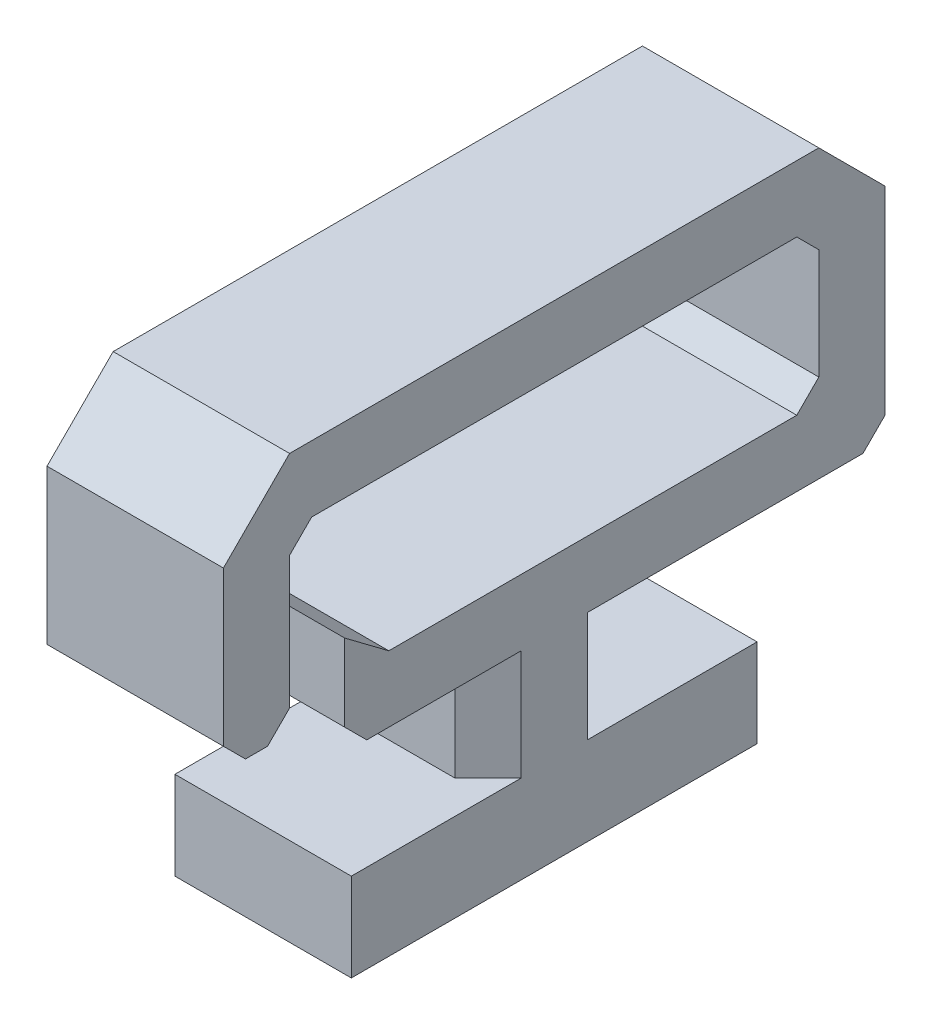
ISO-10303-21;
HEADER;
FILE_DESCRIPTION(('STEP AP214'),'2;1');
FILE_NAME('part.step','',(''),(''),'','','');
FILE_SCHEMA(('AUTOMOTIVE_DESIGN { 1 0 10303 214 1 1 1 1 }'));
ENDSEC;
DATA;
#1=APPLICATION_CONTEXT('core data for automotive mechanical design processes');
#2=APPLICATION_PROTOCOL_DEFINITION('international standard','automotive_design',2000,#1);
#3=PRODUCT_CONTEXT('',#1,'mechanical');
#4=PRODUCT('Part','Part','',(#3));
#5=PRODUCT_RELATED_PRODUCT_CATEGORY('part','',(#4));
#6=PRODUCT_DEFINITION_FORMATION('','',#4);
#7=PRODUCT_DEFINITION_CONTEXT('part definition',#1,'design');
#8=PRODUCT_DEFINITION('design','',#6,#7);
#9=PRODUCT_DEFINITION_SHAPE('','',#8);
#10=(LENGTH_UNIT() NAMED_UNIT(*) SI_UNIT(.MILLI.,.METRE.));
#11=(NAMED_UNIT(*) PLANE_ANGLE_UNIT() SI_UNIT($,.RADIAN.));
#12=(NAMED_UNIT(*) SI_UNIT($,.STERADIAN.) SOLID_ANGLE_UNIT());
#13=UNCERTAINTY_MEASURE_WITH_UNIT(LENGTH_MEASURE(1.E-05),#10,'distance_accuracy_value','');
#14=(GEOMETRIC_REPRESENTATION_CONTEXT(3) GLOBAL_UNCERTAINTY_ASSIGNED_CONTEXT((#13)) GLOBAL_UNIT_ASSIGNED_CONTEXT((#10,
#11,#12)) REPRESENTATION_CONTEXT('',''));
#15=CARTESIAN_POINT('',(0.,0.,0.));
#16=DIRECTION('',(0.,0.,1.));
#17=DIRECTION('',(1.,0.,0.));
#18=AXIS2_PLACEMENT_3D('',#15,#16,#17);
#19=CARTESIAN_POINT('',(4.,1.99999999999999,-1.50000000000001));
#20=DIRECTION('',(0.,-1.,0.));
#21=DIRECTION('',(0.,0.,-1.));
#22=AXIS2_PLACEMENT_3D('',#19,#20,#21);
#23=PLANE('',#22);
#24=DIRECTION('',(0.,0.,1.));
#25=VECTOR('',#24,1.);
#26=CARTESIAN_POINT('',(0.,1.99999999999999,-1.50000000000001));
#27=LINE('',#26,#25);
#28=CARTESIAN_POINT('',(0.,2.,-4.6));
#29=VERTEX_POINT('',#28);
#30=CARTESIAN_POINT('',(0.,1.99999999999999,-0.750000000000003));
#31=VERTEX_POINT('',#30);
#32=EDGE_CURVE('E288',#29,#31,#27,.T.);
#33=ORIENTED_EDGE('',*,*,#32,.T.);
#34=DIRECTION('',(0.707106781186545,0.,-0.70710678118655));
#35=VECTOR('',#34,1.);
#36=CARTESIAN_POINT('',(2.37499999999999,2.,-3.12500000000001));
#37=LINE('',#36,#35);
#38=CARTESIAN_POINT('',(0.749999999999997,1.99999999999999,-1.50000000000001));
#39=VERTEX_POINT('',#38);
#40=EDGE_CURVE('E385',#31,#39,#37,.T.);
#41=ORIENTED_EDGE('',*,*,#40,.T.);
#42=DIRECTION('',(-1.,0.,0.));
#43=VECTOR('',#42,1.);
#44=CARTESIAN_POINT('',(4.,1.99999999999999,-1.50000000000001));
#45=LINE('',#44,#43);
#46=CARTESIAN_POINT('',(3.25,1.99999999999999,-1.50000000000001));
#47=VERTEX_POINT('',#46);
#48=EDGE_CURVE('E347',#47,#39,#45,.T.);
#49=ORIENTED_EDGE('',*,*,#48,.F.);
#50=DIRECTION('',(-0.707106781186549,0.,-0.707106781186546));
#51=VECTOR('',#50,1.);
#52=CARTESIAN_POINT('',(3.625,1.99999999999999,-1.125));
#53=LINE('',#52,#51);
#54=CARTESIAN_POINT('',(4.,1.99999999999999,-0.750000000000005));
#55=VERTEX_POINT('',#54);
#56=EDGE_CURVE('E374',#47,#55,#53,.F.);
#57=ORIENTED_EDGE('',*,*,#56,.T.);
#58=DIRECTION('',(0.,0.,1.));
#59=VECTOR('',#58,1.);
#60=CARTESIAN_POINT('',(4.,1.99999999999999,-1.50000000000001));
#61=LINE('',#60,#59);
#62=CARTESIAN_POINT('',(4.,2.,-4.6));
#63=VERTEX_POINT('',#62);
#64=EDGE_CURVE('E326',#63,#55,#61,.T.);
#65=ORIENTED_EDGE('',*,*,#64,.F.);
#66=DIRECTION('',(-1.,0.,0.));
#67=VECTOR('',#66,1.);
#68=CARTESIAN_POINT('',(4.,2.,-4.6));
#69=LINE('',#68,#67);
#70=EDGE_CURVE('E287',#63,#29,#69,.T.);
#71=ORIENTED_EDGE('',*,*,#70,.T.);
#72=EDGE_LOOP('',(#33,#41,#49,#57,#65,#71));
#73=FACE_BOUND('',#72,.T.);
#74=ADVANCED_FACE('F34',(#73),#23,.F.);
#75=CARTESIAN_POINT('',(4.,4.5,-1.5));
#76=DIRECTION('',(0.,0.,1.));
#77=DIRECTION('',(0.,-1.,0.));
#78=AXIS2_PLACEMENT_3D('',#75,#76,#77);
#79=PLANE('',#78);
#80=DIRECTION('',(-1.,0.,0.));
#81=VECTOR('',#80,1.);
#82=CARTESIAN_POINT('',(4.,4.5,-1.5));
#83=LINE('',#82,#81);
#84=CARTESIAN_POINT('',(3.25,4.5,-1.5));
#85=VERTEX_POINT('',#84);
#86=CARTESIAN_POINT('',(0.749999999999997,4.5,-1.5));
#87=VERTEX_POINT('',#86);
#88=EDGE_CURVE('E266',#85,#87,#83,.T.);
#89=ORIENTED_EDGE('',*,*,#88,.F.);
#90=DIRECTION('',(0.,-1.,0.));
#91=VECTOR('',#90,1.);
#92=CARTESIAN_POINT('',(3.25,4.5,-1.5));
#93=LINE('',#92,#91);
#94=EDGE_CURVE('E359',#85,#47,#93,.T.);
#95=ORIENTED_EDGE('',*,*,#94,.T.);
#96=ORIENTED_EDGE('',*,*,#48,.T.);
#97=DIRECTION('',(0.,1.,0.));
#98=VECTOR('',#97,1.);
#99=CARTESIAN_POINT('',(0.749999999999997,4.5,-1.5));
#100=LINE('',#99,#98);
#101=EDGE_CURVE('E356',#39,#87,#100,.T.);
#102=ORIENTED_EDGE('',*,*,#101,.T.);
#103=EDGE_LOOP('',(#89,#95,#96,#102));
#104=FACE_BOUND('',#103,.T.);
#105=ADVANCED_FACE('F532',(#104),#79,.F.);
#106=CARTESIAN_POINT('',(4.,4.5,-7.5));
#107=DIRECTION('',(0.,1.,0.));
#108=DIRECTION('',(0.,0.,1.));
#109=AXIS2_PLACEMENT_3D('',#106,#107,#108);
#110=PLANE('',#109);
#111=DIRECTION('',(0.,0.,-1.));
#112=VECTOR('',#111,1.);
#113=CARTESIAN_POINT('',(0.,4.5,-7.5));
#114=LINE('',#113,#112);
#115=CARTESIAN_POINT('',(0.,4.5,-0.749999999999999));
#116=VERTEX_POINT('',#115);
#117=CARTESIAN_POINT('',(0.,4.5,-7.));
#118=VERTEX_POINT('',#117);
#119=EDGE_CURVE('E290',#116,#118,#114,.T.);
#120=ORIENTED_EDGE('',*,*,#119,.T.);
#121=DIRECTION('',(1.,0.,0.));
#122=VECTOR('',#121,1.);
#123=CARTESIAN_POINT('',(4.,4.5,-7.));
#124=LINE('',#123,#122);
#125=CARTESIAN_POINT('',(4.,4.5,-7.));
#126=VERTEX_POINT('',#125);
#127=EDGE_CURVE('E58',#118,#126,#124,.T.);
#128=ORIENTED_EDGE('',*,*,#127,.T.);
#129=DIRECTION('',(0.,0.,-1.));
#130=VECTOR('',#129,1.);
#131=CARTESIAN_POINT('',(4.,4.5,-7.5));
#132=LINE('',#131,#130);
#133=CARTESIAN_POINT('',(4.,4.5,-0.750000000000001));
#134=VERTEX_POINT('',#133);
#135=EDGE_CURVE('E498',#134,#126,#132,.T.);
#136=ORIENTED_EDGE('',*,*,#135,.F.);
#137=DIRECTION('',(0.707106781186549,0.,0.707106781186546));
#138=VECTOR('',#137,1.);
#139=CARTESIAN_POINT('',(0.625,4.5,-4.12499999999999));
#140=LINE('',#139,#138);
#141=EDGE_CURVE('E372',#134,#85,#140,.F.);
#142=ORIENTED_EDGE('',*,*,#141,.T.);
#143=ORIENTED_EDGE('',*,*,#88,.T.);
#144=DIRECTION('',(-0.707106781186545,0.,0.70710678118655));
#145=VECTOR('',#144,1.);
#146=CARTESIAN_POINT('',(5.37499999999999,4.5,-6.12500000000002));
#147=LINE('',#146,#145);
#148=EDGE_CURVE('E382',#87,#116,#147,.T.);
#149=ORIENTED_EDGE('',*,*,#148,.T.);
#150=EDGE_LOOP('',(#120,#128,#136,#142,#143,#149));
#151=FACE_BOUND('',#150,.T.);
#152=ADVANCED_FACE('F538',(#151),#110,.F.);
#153=CARTESIAN_POINT('',(4.,11.,-7.5));
#154=DIRECTION('',(0.,0.,1.));
#155=DIRECTION('',(0.,-1.,0.));
#156=AXIS2_PLACEMENT_3D('',#153,#154,#155);
#157=PLANE('',#156);
#158=DIRECTION('',(0.,1.,0.));
#159=VECTOR('',#158,1.);
#160=CARTESIAN_POINT('',(4.,11.,-7.5));
#161=LINE('',#160,#159);
#162=CARTESIAN_POINT('',(4.,5.,-7.5));
#163=VERTEX_POINT('',#162);
#164=CARTESIAN_POINT('',(4.,9.49999999999999,-7.5));
#165=VERTEX_POINT('',#164);
#166=EDGE_CURVE('E496',#163,#165,#161,.T.);
#167=ORIENTED_EDGE('',*,*,#166,.F.);
#168=DIRECTION('',(-1.,0.,0.));
#169=VECTOR('',#168,1.);
#170=CARTESIAN_POINT('',(4.,5.,-7.5));
#171=LINE('',#170,#169);
#172=CARTESIAN_POINT('',(0.,5.,-7.5));
#173=VERTEX_POINT('',#172);
#174=EDGE_CURVE('E444',#163,#173,#171,.T.);
#175=ORIENTED_EDGE('',*,*,#174,.T.);
#176=DIRECTION('',(0.,1.,0.));
#177=VECTOR('',#176,1.);
#178=CARTESIAN_POINT('',(0.,11.,-7.5));
#179=LINE('',#178,#177);
#180=CARTESIAN_POINT('',(0.,9.49999999999999,-7.5));
#181=VERTEX_POINT('',#180);
#182=EDGE_CURVE('E293',#173,#181,#179,.T.);
#183=ORIENTED_EDGE('',*,*,#182,.T.);
#184=DIRECTION('',(1.,0.,0.));
#185=VECTOR('',#184,1.);
#186=CARTESIAN_POINT('',(4.,9.49999999999999,-7.5));
#187=LINE('',#186,#185);
#188=EDGE_CURVE('E409',#181,#165,#187,.T.);
#189=ORIENTED_EDGE('',*,*,#188,.T.);
#190=EDGE_LOOP('',(#167,#175,#183,#189));
#191=FACE_BOUND('',#190,.T.);
#192=ADVANCED_FACE('F622',(#191),#157,.F.);
#193=CARTESIAN_POINT('',(4.,11.,7.5));
#194=DIRECTION('',(0.,-1.,0.));
#195=DIRECTION('',(0.,0.,-1.));
#196=AXIS2_PLACEMENT_3D('',#193,#194,#195);
#197=PLANE('',#196);
#198=DIRECTION('',(0.,0.,1.));
#199=VECTOR('',#198,1.);
#200=CARTESIAN_POINT('',(0.,11.,7.5));
#201=LINE('',#200,#199);
#202=CARTESIAN_POINT('',(0.,11.,-6.));
#203=VERTEX_POINT('',#202);
#204=CARTESIAN_POINT('',(0.,11.,5.99999999999999));
#205=VERTEX_POINT('',#204);
#206=EDGE_CURVE('E295',#203,#205,#201,.T.);
#207=ORIENTED_EDGE('',*,*,#206,.T.);
#208=DIRECTION('',(1.,0.,0.));
#209=VECTOR('',#208,1.);
#210=CARTESIAN_POINT('',(4.,11.,5.99999999999999));
#211=LINE('',#210,#209);
#212=CARTESIAN_POINT('',(4.,11.,5.99999999999999));
#213=VERTEX_POINT('',#212);
#214=EDGE_CURVE('E403',#205,#213,#211,.T.);
#215=ORIENTED_EDGE('',*,*,#214,.T.);
#216=DIRECTION('',(0.,0.,1.));
#217=VECTOR('',#216,1.);
#218=CARTESIAN_POINT('',(4.,11.,7.5));
#219=LINE('',#218,#217);
#220=CARTESIAN_POINT('',(4.,11.,-6.));
#221=VERTEX_POINT('',#220);
#222=EDGE_CURVE('E493',#221,#213,#219,.T.);
#223=ORIENTED_EDGE('',*,*,#222,.F.);
#224=DIRECTION('',(-1.,0.,0.));
#225=VECTOR('',#224,1.);
#226=CARTESIAN_POINT('',(4.,11.,-6.));
#227=LINE('',#226,#225);
#228=EDGE_CURVE('E400',#221,#203,#227,.T.);
#229=ORIENTED_EDGE('',*,*,#228,.T.);
#230=EDGE_LOOP('',(#207,#215,#223,#229));
#231=FACE_BOUND('',#230,.T.);
#232=ADVANCED_FACE('F630',(#231),#197,.F.);
#233=CARTESIAN_POINT('',(4.,4.5,7.5));
#234=DIRECTION('',(0.,0.,-1.));
#235=DIRECTION('',(0.,1.,0.));
#236=AXIS2_PLACEMENT_3D('',#233,#234,#235);
#237=PLANE('',#236);
#238=DIRECTION('',(0.,-1.,0.));
#239=VECTOR('',#238,1.);
#240=CARTESIAN_POINT('',(0.,4.5,7.5));
#241=LINE('',#240,#239);
#242=CARTESIAN_POINT('',(0.,9.5,7.5));
#243=VERTEX_POINT('',#242);
#244=CARTESIAN_POINT('',(0.,6.,7.5));
#245=VERTEX_POINT('',#244);
#246=EDGE_CURVE('E298',#243,#245,#241,.T.);
#247=ORIENTED_EDGE('',*,*,#246,.T.);
#248=DIRECTION('',(1.,0.,0.));
#249=VECTOR('',#248,1.);
#250=CARTESIAN_POINT('',(4.,6.,7.5));
#251=LINE('',#250,#249);
#252=CARTESIAN_POINT('',(4.,6.,7.5));
#253=VERTEX_POINT('',#252);
#254=EDGE_CURVE('E437',#245,#253,#251,.T.);
#255=ORIENTED_EDGE('',*,*,#254,.T.);
#256=DIRECTION('',(0.,-1.,0.));
#257=VECTOR('',#256,1.);
#258=CARTESIAN_POINT('',(4.,4.5,7.5));
#259=LINE('',#258,#257);
#260=CARTESIAN_POINT('',(4.,9.5,7.5));
#261=VERTEX_POINT('',#260);
#262=EDGE_CURVE('E490',#261,#253,#259,.T.);
#263=ORIENTED_EDGE('',*,*,#262,.F.);
#264=DIRECTION('',(-1.,0.,0.));
#265=VECTOR('',#264,1.);
#266=CARTESIAN_POINT('',(4.,9.5,7.5));
#267=LINE('',#266,#265);
#268=EDGE_CURVE('E392',#261,#243,#267,.T.);
#269=ORIENTED_EDGE('',*,*,#268,.T.);
#270=EDGE_LOOP('',(#247,#255,#263,#269));
#271=FACE_BOUND('',#270,.T.);
#272=ADVANCED_FACE('F635',(#271),#237,.F.);
#273=CARTESIAN_POINT('',(4.,9.5,6.));
#274=DIRECTION('',(0.,0.,1.));
#275=DIRECTION('',(1.,0.,0.));
#276=AXIS2_PLACEMENT_3D('',#273,#274,#275);
#277=PLANE('',#276);
#278=DIRECTION('',(0.,1.,0.));
#279=VECTOR('',#278,1.);
#280=CARTESIAN_POINT('',(4.,6.,6.));
#281=LINE('',#280,#279);
#282=CARTESIAN_POINT('',(4.,6.,6.));
#283=VERTEX_POINT('',#282);
#284=CARTESIAN_POINT('',(4.,9.,6.));
#285=VERTEX_POINT('',#284);
#286=EDGE_CURVE('E485',#283,#285,#281,.T.);
#287=ORIENTED_EDGE('',*,*,#286,.F.);
#288=DIRECTION('',(-1.,0.,0.));
#289=VECTOR('',#288,1.);
#290=CARTESIAN_POINT('',(4.,6.,6.));
#291=LINE('',#290,#289);
#292=CARTESIAN_POINT('',(0.,6.,6.));
#293=VERTEX_POINT('',#292);
#294=EDGE_CURVE('E414',#283,#293,#291,.T.);
#295=ORIENTED_EDGE('',*,*,#294,.T.);
#296=DIRECTION('',(0.,1.,0.));
#297=VECTOR('',#296,1.);
#298=CARTESIAN_POINT('',(0.,9.5,6.));
#299=LINE('',#298,#297);
#300=CARTESIAN_POINT('',(0.,9.,6.));
#301=VERTEX_POINT('',#300);
#302=EDGE_CURVE('E301',#293,#301,#299,.T.);
#303=ORIENTED_EDGE('',*,*,#302,.T.);
#304=DIRECTION('',(1.,0.,0.));
#305=VECTOR('',#304,1.);
#306=CARTESIAN_POINT('',(4.,9.,6.));
#307=LINE('',#306,#305);
#308=EDGE_CURVE('E412',#301,#285,#307,.T.);
#309=ORIENTED_EDGE('',*,*,#308,.T.);
#310=EDGE_LOOP('',(#287,#295,#303,#309));
#311=FACE_BOUND('',#310,.T.);
#312=ADVANCED_FACE('F515',(#311),#277,.F.);
#313=CARTESIAN_POINT('',(4.,9.5,-6.));
#314=DIRECTION('',(0.,1.,0.));
#315=DIRECTION('',(0.,0.,1.));
#316=AXIS2_PLACEMENT_3D('',#313,#314,#315);
#317=PLANE('',#316);
#318=DIRECTION('',(0.,0.,-1.));
#319=VECTOR('',#318,1.);
#320=CARTESIAN_POINT('',(4.,9.5,-6.));
#321=LINE('',#320,#319);
#322=CARTESIAN_POINT('',(4.,9.5,5.49999999999999));
#323=VERTEX_POINT('',#322);
#324=CARTESIAN_POINT('',(4.,9.5,-5.5));
#325=VERTEX_POINT('',#324);
#326=EDGE_CURVE('E481',#323,#325,#321,.T.);
#327=ORIENTED_EDGE('',*,*,#326,.F.);
#328=DIRECTION('',(-1.,0.,0.));
#329=VECTOR('',#328,1.);
#330=CARTESIAN_POINT('',(0.,9.5,5.49999999999999));
#331=LINE('',#330,#329);
#332=CARTESIAN_POINT('',(0.,9.5,5.49999999999999));
#333=VERTEX_POINT('',#332);
#334=EDGE_CURVE('E457',#323,#333,#331,.T.);
#335=ORIENTED_EDGE('',*,*,#334,.T.);
#336=DIRECTION('',(0.,0.,-1.));
#337=VECTOR('',#336,1.);
#338=CARTESIAN_POINT('',(0.,9.5,-6.));
#339=LINE('',#338,#337);
#340=CARTESIAN_POINT('',(0.,9.5,-5.5));
#341=VERTEX_POINT('',#340);
#342=EDGE_CURVE('E304',#333,#341,#339,.T.);
#343=ORIENTED_EDGE('',*,*,#342,.T.);
#344=DIRECTION('',(1.,0.,0.));
#345=VECTOR('',#344,1.);
#346=CARTESIAN_POINT('',(4.,9.5,-5.5));
#347=LINE('',#346,#345);
#348=EDGE_CURVE('E455',#341,#325,#347,.T.);
#349=ORIENTED_EDGE('',*,*,#348,.T.);
#350=EDGE_LOOP('',(#327,#335,#343,#349));
#351=FACE_BOUND('',#350,.T.);
#352=ADVANCED_FACE('F476',(#351),#317,.F.);
#353=CARTESIAN_POINT('',(4.,6.,-6.));
#354=DIRECTION('',(0.,0.,-1.));
#355=DIRECTION('',(-1.,0.,0.));
#356=AXIS2_PLACEMENT_3D('',#353,#354,#355);
#357=PLANE('',#356);
#358=DIRECTION('',(0.,-1.,0.));
#359=VECTOR('',#358,1.);
#360=CARTESIAN_POINT('',(0.,6.,-6.));
#361=LINE('',#360,#359);
#362=CARTESIAN_POINT('',(0.,8.99999999999999,-6.));
#363=VERTEX_POINT('',#362);
#364=CARTESIAN_POINT('',(0.,6.5,-6.));
#365=VERTEX_POINT('',#364);
#366=EDGE_CURVE('E307',#363,#365,#361,.T.);
#367=ORIENTED_EDGE('',*,*,#366,.T.);
#368=DIRECTION('',(1.,0.,0.));
#369=VECTOR('',#368,1.);
#370=CARTESIAN_POINT('',(4.,6.5,-6.));
#371=LINE('',#370,#369);
#372=CARTESIAN_POINT('',(4.,6.5,-6.));
#373=VERTEX_POINT('',#372);
#374=EDGE_CURVE('E453',#365,#373,#371,.T.);
#375=ORIENTED_EDGE('',*,*,#374,.T.);
#376=DIRECTION('',(0.,-1.,0.));
#377=VECTOR('',#376,1.);
#378=CARTESIAN_POINT('',(4.,6.,-6.));
#379=LINE('',#378,#377);
#380=CARTESIAN_POINT('',(4.,8.99999999999999,-6.));
#381=VERTEX_POINT('',#380);
#382=EDGE_CURVE('E256',#381,#373,#379,.T.);
#383=ORIENTED_EDGE('',*,*,#382,.F.);
#384=DIRECTION('',(-1.,0.,0.));
#385=VECTOR('',#384,1.);
#386=CARTESIAN_POINT('',(0.,8.99999999999999,-6.));
#387=LINE('',#386,#385);
#388=EDGE_CURVE('E450',#381,#363,#387,.T.);
#389=ORIENTED_EDGE('',*,*,#388,.T.);
#390=EDGE_LOOP('',(#367,#375,#383,#389));
#391=FACE_BOUND('',#390,.T.);
#392=ADVANCED_FACE('F483',(#391),#357,.F.);
#393=CARTESIAN_POINT('',(4.,6.,3.75));
#394=DIRECTION('',(0.,-1.,0.));
#395=DIRECTION('',(0.,0.,-1.));
#396=AXIS2_PLACEMENT_3D('',#393,#394,#395);
#397=PLANE('',#396);
#398=DIRECTION('',(0.,0.,1.));
#399=VECTOR('',#398,1.);
#400=CARTESIAN_POINT('',(4.,6.,3.75));
#401=LINE('',#400,#399);
#402=CARTESIAN_POINT('',(4.,6.,-5.5));
#403=VERTEX_POINT('',#402);
#404=CARTESIAN_POINT('',(4.,6.,3.75));
#405=VERTEX_POINT('',#404);
#406=EDGE_CURVE('E242',#403,#405,#401,.T.);
#407=ORIENTED_EDGE('',*,*,#406,.F.);
#408=DIRECTION('',(-1.,0.,0.));
#409=VECTOR('',#408,1.);
#410=CARTESIAN_POINT('',(0.,6.,-5.5));
#411=LINE('',#410,#409);
#412=CARTESIAN_POINT('',(0.,6.,-5.5));
#413=VERTEX_POINT('',#412);
#414=EDGE_CURVE('E448',#403,#413,#411,.T.);
#415=ORIENTED_EDGE('',*,*,#414,.T.);
#416=DIRECTION('',(0.,0.,1.));
#417=VECTOR('',#416,1.);
#418=CARTESIAN_POINT('',(0.,6.,3.75));
#419=LINE('',#418,#417);
#420=CARTESIAN_POINT('',(0.,6.,3.75));
#421=VERTEX_POINT('',#420);
#422=EDGE_CURVE('E262',#413,#421,#419,.T.);
#423=ORIENTED_EDGE('',*,*,#422,.T.);
#424=DIRECTION('',(-1.,0.,0.));
#425=VECTOR('',#424,1.);
#426=CARTESIAN_POINT('',(4.,6.,3.75));
#427=LINE('',#426,#425);
#428=EDGE_CURVE('E259',#405,#421,#427,.T.);
#429=ORIENTED_EDGE('',*,*,#428,.F.);
#430=EDGE_LOOP('',(#407,#415,#423,#429));
#431=FACE_BOUND('',#430,.T.);
#432=ADVANCED_FACE('F260',(#431),#397,.F.);
#433=CARTESIAN_POINT('',(4.,6.75,4.75));
#434=DIRECTION('',(0.,-0.8,0.6));
#435=DIRECTION('',(0.,-0.6,-0.8));
#436=AXIS2_PLACEMENT_3D('',#433,#434,#435);
#437=PLANE('',#436);
#438=DIRECTION('',(0.,0.6,0.8));
#439=VECTOR('',#438,1.);
#440=CARTESIAN_POINT('',(0.,6.75,4.75));
#441=LINE('',#440,#439);
#442=CARTESIAN_POINT('',(0.,6.75,4.75));
#443=VERTEX_POINT('',#442);
#444=EDGE_CURVE('E311',#421,#443,#441,.T.);
#445=ORIENTED_EDGE('',*,*,#444,.T.);
#446=DIRECTION('',(-1.,0.,0.));
#447=VECTOR('',#446,1.);
#448=CARTESIAN_POINT('',(4.,6.75,4.75));
#449=LINE('',#448,#447);
#450=CARTESIAN_POINT('',(4.,6.75,4.75));
#451=VERTEX_POINT('',#450);
#452=EDGE_CURVE('E267',#451,#443,#449,.T.);
#453=ORIENTED_EDGE('',*,*,#452,.F.);
#454=DIRECTION('',(0.,0.6,0.8));
#455=VECTOR('',#454,1.);
#456=CARTESIAN_POINT('',(4.,6.75,4.75));
#457=LINE('',#456,#455);
#458=EDGE_CURVE('E248',#405,#451,#457,.T.);
#459=ORIENTED_EDGE('',*,*,#458,.F.);
#460=ORIENTED_EDGE('',*,*,#428,.T.);
#461=EDGE_LOOP('',(#445,#453,#459,#460));
#462=FACE_BOUND('',#461,.T.);
#463=ADVANCED_FACE('F269',(#462),#437,.F.);
#464=CARTESIAN_POINT('',(4.,6.,4.75));
#465=DIRECTION('',(0.,0.,-1.));
#466=DIRECTION('',(-1.,0.,0.));
#467=AXIS2_PLACEMENT_3D('',#464,#465,#466);
#468=PLANE('',#467);
#469=DIRECTION('',(0.,-1.,0.));
#470=VECTOR('',#469,1.);
#471=CARTESIAN_POINT('',(0.,6.,4.75));
#472=LINE('',#471,#470);
#473=CARTESIAN_POINT('',(0.,5.,4.75));
#474=VERTEX_POINT('',#473);
#475=EDGE_CURVE('E313',#443,#474,#472,.T.);
#476=ORIENTED_EDGE('',*,*,#475,.T.);
#477=DIRECTION('',(1.,0.,0.));
#478=VECTOR('',#477,1.);
#479=CARTESIAN_POINT('',(4.,5.,4.75));
#480=LINE('',#479,#478);
#481=CARTESIAN_POINT('',(4.,5.,4.75));
#482=VERTEX_POINT('',#481);
#483=EDGE_CURVE('E442',#474,#482,#480,.T.);
#484=ORIENTED_EDGE('',*,*,#483,.T.);
#485=DIRECTION('',(0.,-1.,0.));
#486=VECTOR('',#485,1.);
#487=CARTESIAN_POINT('',(4.,6.,4.75));
#488=LINE('',#487,#486);
#489=EDGE_CURVE('E272',#451,#482,#488,.T.);
#490=ORIENTED_EDGE('',*,*,#489,.F.);
#491=ORIENTED_EDGE('',*,*,#452,.T.);
#492=EDGE_LOOP('',(#476,#484,#490,#491));
#493=FACE_BOUND('',#492,.T.);
#494=ADVANCED_FACE('F670',(#493),#468,.F.);
#495=CARTESIAN_POINT('',(4.,4.5,1.5));
#496=DIRECTION('',(0.,1.,0.));
#497=DIRECTION('',(0.,0.,1.));
#498=AXIS2_PLACEMENT_3D('',#495,#496,#497);
#499=PLANE('',#498);
#500=DIRECTION('',(0.,0.,-1.));
#501=VECTOR('',#500,1.);
#502=CARTESIAN_POINT('',(4.,4.5,1.5));
#503=LINE('',#502,#501);
#504=CARTESIAN_POINT('',(4.,4.5,4.25));
#505=VERTEX_POINT('',#504);
#506=CARTESIAN_POINT('',(4.,4.5,0.75));
#507=VERTEX_POINT('',#506);
#508=EDGE_CURVE('E274',#505,#507,#503,.T.);
#509=ORIENTED_EDGE('',*,*,#508,.F.);
#510=DIRECTION('',(-1.,0.,0.));
#511=VECTOR('',#510,1.);
#512=CARTESIAN_POINT('',(4.,4.5,4.25));
#513=LINE('',#512,#511);
#514=CARTESIAN_POINT('',(0.,4.5,4.25));
#515=VERTEX_POINT('',#514);
#516=EDGE_CURVE('E439',#505,#515,#513,.T.);
#517=ORIENTED_EDGE('',*,*,#516,.T.);
#518=DIRECTION('',(0.,0.,-1.));
#519=VECTOR('',#518,1.);
#520=CARTESIAN_POINT('',(0.,4.5,1.5));
#521=LINE('',#520,#519);
#522=CARTESIAN_POINT('',(0.,4.5,0.749999999999998));
#523=VERTEX_POINT('',#522);
#524=EDGE_CURVE('E316',#515,#523,#521,.T.);
#525=ORIENTED_EDGE('',*,*,#524,.T.);
#526=DIRECTION('',(0.707106781186545,0.,0.70710678118655));
#527=VECTOR('',#526,1.);
#528=CARTESIAN_POINT('',(2.37499999999999,4.5,3.125));
#529=LINE('',#528,#527);
#530=CARTESIAN_POINT('',(0.749999999999997,4.5,1.5));
#531=VERTEX_POINT('',#530);
#532=EDGE_CURVE('E390',#523,#531,#529,.T.);
#533=ORIENTED_EDGE('',*,*,#532,.T.);
#534=DIRECTION('',(-1.,0.,0.));
#535=VECTOR('',#534,1.);
#536=CARTESIAN_POINT('',(4.,4.5,1.5));
#537=LINE('',#536,#535);
#538=CARTESIAN_POINT('',(3.25,4.5,1.5));
#539=VERTEX_POINT('',#538);
#540=EDGE_CURVE('E341',#539,#531,#537,.T.);
#541=ORIENTED_EDGE('',*,*,#540,.F.);
#542=DIRECTION('',(-0.707106781186549,0.,0.707106781186546));
#543=VECTOR('',#542,1.);
#544=CARTESIAN_POINT('',(3.625,4.5,1.125));
#545=LINE('',#544,#543);
#546=EDGE_CURVE('E379',#539,#507,#545,.F.);
#547=ORIENTED_EDGE('',*,*,#546,.T.);
#548=EDGE_LOOP('',(#509,#517,#525,#533,#541,#547));
#549=FACE_BOUND('',#548,.T.);
#550=ADVANCED_FACE('F666',(#549),#499,.F.);
#551=CARTESIAN_POINT('',(4.,2.,1.5));
#552=DIRECTION('',(0.,0.,-1.));
#553=DIRECTION('',(-1.,0.,0.));
#554=AXIS2_PLACEMENT_3D('',#551,#552,#553);
#555=PLANE('',#554);
#556=DIRECTION('',(-1.,0.,0.));
#557=VECTOR('',#556,1.);
#558=CARTESIAN_POINT('',(4.,2.,1.5));
#559=LINE('',#558,#557);
#560=CARTESIAN_POINT('',(3.25,2.,1.5));
#561=VERTEX_POINT('',#560);
#562=CARTESIAN_POINT('',(0.749999999999997,2.,1.5));
#563=VERTEX_POINT('',#562);
#564=EDGE_CURVE('E338',#561,#563,#559,.T.);
#565=ORIENTED_EDGE('',*,*,#564,.F.);
#566=DIRECTION('',(0.,1.,0.));
#567=VECTOR('',#566,1.);
#568=CARTESIAN_POINT('',(3.25,2.,1.5));
#569=LINE('',#568,#567);
#570=EDGE_CURVE('E364',#561,#539,#569,.T.);
#571=ORIENTED_EDGE('',*,*,#570,.T.);
#572=ORIENTED_EDGE('',*,*,#540,.T.);
#573=DIRECTION('',(0.,-1.,0.));
#574=VECTOR('',#573,1.);
#575=CARTESIAN_POINT('',(0.749999999999997,2.,1.5));
#576=LINE('',#575,#574);
#577=EDGE_CURVE('E361',#531,#563,#576,.T.);
#578=ORIENTED_EDGE('',*,*,#577,.T.);
#579=EDGE_LOOP('',(#565,#571,#572,#578));
#580=FACE_BOUND('',#579,.T.);
#581=ADVANCED_FACE('F662',(#580),#555,.F.);
#582=CARTESIAN_POINT('',(4.,2.,4.6));
#583=DIRECTION('',(0.,-1.,0.));
#584=DIRECTION('',(0.,0.,-1.));
#585=AXIS2_PLACEMENT_3D('',#582,#583,#584);
#586=PLANE('',#585);
#587=DIRECTION('',(0.,0.,1.));
#588=VECTOR('',#587,1.);
#589=CARTESIAN_POINT('',(0.,2.,4.6));
#590=LINE('',#589,#588);
#591=CARTESIAN_POINT('',(0.,2.,0.749999999999998));
#592=VERTEX_POINT('',#591);
#593=CARTESIAN_POINT('',(0.,2.,4.6));
#594=VERTEX_POINT('',#593);
#595=EDGE_CURVE('E318',#592,#594,#590,.T.);
#596=ORIENTED_EDGE('',*,*,#595,.T.);
#597=DIRECTION('',(-1.,0.,0.));
#598=VECTOR('',#597,1.);
#599=CARTESIAN_POINT('',(4.,2.,4.6));
#600=LINE('',#599,#598);
#601=CARTESIAN_POINT('',(4.,2.,4.6));
#602=VERTEX_POINT('',#601);
#603=EDGE_CURVE('E335',#602,#594,#600,.T.);
#604=ORIENTED_EDGE('',*,*,#603,.F.);
#605=DIRECTION('',(0.,0.,1.));
#606=VECTOR('',#605,1.);
#607=CARTESIAN_POINT('',(4.,2.,4.6));
#608=LINE('',#607,#606);
#609=CARTESIAN_POINT('',(4.,2.,0.749999999999999));
#610=VERTEX_POINT('',#609);
#611=EDGE_CURVE('E279',#610,#602,#608,.T.);
#612=ORIENTED_EDGE('',*,*,#611,.F.);
#613=DIRECTION('',(0.707106781186549,0.,-0.707106781186546));
#614=VECTOR('',#613,1.);
#615=CARTESIAN_POINT('',(2.075,2.,2.67499999999999));
#616=LINE('',#615,#614);
#617=EDGE_CURVE('E377',#610,#561,#616,.F.);
#618=ORIENTED_EDGE('',*,*,#617,.T.);
#619=ORIENTED_EDGE('',*,*,#564,.T.);
#620=DIRECTION('',(-0.707106781186545,0.,-0.70710678118655));
#621=VECTOR('',#620,1.);
#622=CARTESIAN_POINT('',(3.92499999999999,2.,4.67500000000001));
#623=LINE('',#622,#621);
#624=EDGE_CURVE('E387',#563,#592,#623,.T.);
#625=ORIENTED_EDGE('',*,*,#624,.T.);
#626=EDGE_LOOP('',(#596,#604,#612,#618,#619,#625));
#627=FACE_BOUND('',#626,.T.);
#628=ADVANCED_FACE('F658',(#627),#586,.F.);
#629=CARTESIAN_POINT('',(4.,0.,4.6));
#630=DIRECTION('',(0.,0.,-1.));
#631=DIRECTION('',(-1.,0.,0.));
#632=AXIS2_PLACEMENT_3D('',#629,#630,#631);
#633=PLANE('',#632);
#634=DIRECTION('',(0.,-1.,0.));
#635=VECTOR('',#634,1.);
#636=CARTESIAN_POINT('',(0.,0.,4.6));
#637=LINE('',#636,#635);
#638=CARTESIAN_POINT('',(0.,0.,4.6));
#639=VERTEX_POINT('',#638);
#640=EDGE_CURVE('E320',#594,#639,#637,.T.);
#641=ORIENTED_EDGE('',*,*,#640,.T.);
#642=DIRECTION('',(-1.,0.,0.));
#643=VECTOR('',#642,1.);
#644=CARTESIAN_POINT('',(4.,0.,4.6));
#645=LINE('',#644,#643);
#646=CARTESIAN_POINT('',(4.,0.,4.6));
#647=VERTEX_POINT('',#646);
#648=EDGE_CURVE('E332',#647,#639,#645,.T.);
#649=ORIENTED_EDGE('',*,*,#648,.F.);
#650=DIRECTION('',(0.,-1.,0.));
#651=VECTOR('',#650,1.);
#652=CARTESIAN_POINT('',(4.,0.,4.6));
#653=LINE('',#652,#651);
#654=EDGE_CURVE('E281',#602,#647,#653,.T.);
#655=ORIENTED_EDGE('',*,*,#654,.F.);
#656=ORIENTED_EDGE('',*,*,#603,.T.);
#657=EDGE_LOOP('',(#641,#649,#655,#656));
#658=FACE_BOUND('',#657,.T.);
#659=ADVANCED_FACE('F654',(#658),#633,.F.);
#660=CARTESIAN_POINT('',(4.,0.,4.6));
#661=DIRECTION('',(0.,1.,0.));
#662=DIRECTION('',(0.,0.,1.));
#663=AXIS2_PLACEMENT_3D('',#660,#661,#662);
#664=PLANE('',#663);
#665=DIRECTION('',(0.,0.,-1.));
#666=VECTOR('',#665,1.);
#667=CARTESIAN_POINT('',(0.,0.,4.6));
#668=LINE('',#667,#666);
#669=CARTESIAN_POINT('',(0.,0.,-4.6));
#670=VERTEX_POINT('',#669);
#671=EDGE_CURVE('E322',#639,#670,#668,.T.);
#672=ORIENTED_EDGE('',*,*,#671,.T.);
#673=DIRECTION('',(-1.,0.,0.));
#674=VECTOR('',#673,1.);
#675=CARTESIAN_POINT('',(4.,0.,-4.6));
#676=LINE('',#675,#674);
#677=CARTESIAN_POINT('',(4.,0.,-4.6));
#678=VERTEX_POINT('',#677);
#679=EDGE_CURVE('E329',#678,#670,#676,.T.);
#680=ORIENTED_EDGE('',*,*,#679,.F.);
#681=DIRECTION('',(0.,0.,-1.));
#682=VECTOR('',#681,1.);
#683=CARTESIAN_POINT('',(4.,0.,4.6));
#684=LINE('',#683,#682);
#685=EDGE_CURVE('E283',#647,#678,#684,.T.);
#686=ORIENTED_EDGE('',*,*,#685,.F.);
#687=ORIENTED_EDGE('',*,*,#648,.T.);
#688=EDGE_LOOP('',(#672,#680,#686,#687));
#689=FACE_BOUND('',#688,.T.);
#690=ADVANCED_FACE('F650',(#689),#664,.F.);
#691=CARTESIAN_POINT('',(4.,2.,-4.6));
#692=DIRECTION('',(0.,0.,1.));
#693=DIRECTION('',(1.,0.,0.));
#694=AXIS2_PLACEMENT_3D('',#691,#692,#693);
#695=PLANE('',#694);
#696=DIRECTION('',(0.,1.,0.));
#697=VECTOR('',#696,1.);
#698=CARTESIAN_POINT('',(0.,2.,-4.6));
#699=LINE('',#698,#697);
#700=EDGE_CURVE('E324',#670,#29,#699,.T.);
#701=ORIENTED_EDGE('',*,*,#700,.T.);
#702=ORIENTED_EDGE('',*,*,#70,.F.);
#703=DIRECTION('',(0.,1.,0.));
#704=VECTOR('',#703,1.);
#705=CARTESIAN_POINT('',(4.,2.,-4.6));
#706=LINE('',#705,#704);
#707=EDGE_CURVE('E285',#678,#63,#706,.T.);
#708=ORIENTED_EDGE('',*,*,#707,.F.);
#709=ORIENTED_EDGE('',*,*,#679,.T.);
#710=EDGE_LOOP('',(#701,#702,#708,#709));
#711=FACE_BOUND('',#710,.T.);
#712=ADVANCED_FACE('F645',(#711),#695,.F.);
#713=CARTESIAN_POINT('',(4.,0.,0.));
#714=DIRECTION('',(-1.,0.,0.));
#715=DIRECTION('',(0.,0.,1.));
#716=AXIS2_PLACEMENT_3D('',#713,#714,#715);
#717=PLANE('',#716);
#718=DIRECTION('',(0.,0.,-1.));
#719=VECTOR('',#718,1.);
#720=CARTESIAN_POINT('',(4.,5.5,6.));
#721=LINE('',#720,#719);
#722=CARTESIAN_POINT('',(4.,5.5,7.));
#723=VERTEX_POINT('',#722);
#724=CARTESIAN_POINT('',(4.,5.5,6.5));
#725=VERTEX_POINT('',#724);
#726=EDGE_CURVE('E291',#723,#725,#721,.T.);
#727=ORIENTED_EDGE('',*,*,#726,.T.);
#728=DIRECTION('',(0.,-0.707106781186546,0.707106781186549));
#729=VECTOR('',#728,1.);
#730=CARTESIAN_POINT('',(4.,6.,6.));
#731=LINE('',#730,#729);
#732=EDGE_CURVE('E435',#725,#283,#731,.F.);
#733=ORIENTED_EDGE('',*,*,#732,.T.);
#734=ORIENTED_EDGE('',*,*,#286,.T.);
#735=DIRECTION('',(0.,-0.707106781186543,0.707106781186552));
#736=VECTOR('',#735,1.);
#737=CARTESIAN_POINT('',(4.,7.50000000000006,7.49999999999996));
#738=LINE('',#737,#736);
#739=EDGE_CURVE('E465',#285,#323,#738,.F.);
#740=ORIENTED_EDGE('',*,*,#739,.T.);
#741=ORIENTED_EDGE('',*,*,#326,.T.);
#742=DIRECTION('',(0.,0.707106781186552,0.707106781186543));
#743=VECTOR('',#742,1.);
#744=CARTESIAN_POINT('',(4.,7.49999999999993,-7.50000000000004));
#745=LINE('',#744,#743);
#746=EDGE_CURVE('E11',#325,#381,#745,.F.);
#747=ORIENTED_EDGE('',*,*,#746,.T.);
#748=ORIENTED_EDGE('',*,*,#382,.T.);
#749=DIRECTION('',(0.,0.707106781186544,-0.707106781186551));
#750=VECTOR('',#749,1.);
#751=CARTESIAN_POINT('',(4.,0.250000000000033,0.25000000000003));
#752=LINE('',#751,#750);
#753=EDGE_CURVE('E252',#373,#403,#752,.F.);
#754=ORIENTED_EDGE('',*,*,#753,.T.);
#755=ORIENTED_EDGE('',*,*,#406,.T.);
#756=ORIENTED_EDGE('',*,*,#458,.T.);
#757=ORIENTED_EDGE('',*,*,#489,.T.);
#758=DIRECTION('',(0.,0.707106781186549,0.707106781186546));
#759=VECTOR('',#758,1.);
#760=CARTESIAN_POINT('',(4.,4.5,4.25));
#761=LINE('',#760,#759);
#762=EDGE_CURVE('E431',#482,#505,#761,.F.);
#763=ORIENTED_EDGE('',*,*,#762,.T.);
#764=ORIENTED_EDGE('',*,*,#508,.T.);
#765=DIRECTION('',(0.,-1.,0.));
#766=VECTOR('',#765,1.);
#767=CARTESIAN_POINT('',(4.,0.,0.749999999999999));
#768=LINE('',#767,#766);
#769=EDGE_CURVE('E350',#507,#610,#768,.T.);
#770=ORIENTED_EDGE('',*,*,#769,.T.);
#771=ORIENTED_EDGE('',*,*,#611,.T.);
#772=ORIENTED_EDGE('',*,*,#654,.T.);
#773=ORIENTED_EDGE('',*,*,#685,.T.);
#774=ORIENTED_EDGE('',*,*,#707,.T.);
#775=ORIENTED_EDGE('',*,*,#64,.T.);
#776=DIRECTION('',(0.,1.,0.));
#777=VECTOR('',#776,1.);
#778=CARTESIAN_POINT('',(4.,0.,-0.750000000000008));
#779=LINE('',#778,#777);
#780=EDGE_CURVE('E353',#55,#134,#779,.T.);
#781=ORIENTED_EDGE('',*,*,#780,.T.);
#782=ORIENTED_EDGE('',*,*,#135,.T.);
#783=DIRECTION('',(0.,-0.707106781186545,0.70710678118655));
#784=VECTOR('',#783,1.);
#785=CARTESIAN_POINT('',(4.,5.,-7.5));
#786=LINE('',#785,#784);
#787=EDGE_CURVE('E50',#126,#163,#786,.F.);
#788=ORIENTED_EDGE('',*,*,#787,.T.);
#789=ORIENTED_EDGE('',*,*,#166,.T.);
#790=DIRECTION('',(0.,-0.707106781186549,-0.707106781186546));
#791=VECTOR('',#790,1.);
#792=CARTESIAN_POINT('',(4.,11.,-6.));
#793=LINE('',#792,#791);
#794=EDGE_CURVE('E405',#165,#221,#793,.F.);
#795=ORIENTED_EDGE('',*,*,#794,.T.);
#796=ORIENTED_EDGE('',*,*,#222,.T.);
#797=DIRECTION('',(0.,0.707106781186546,-0.707106781186549));
#798=VECTOR('',#797,1.);
#799=CARTESIAN_POINT('',(4.,9.5,7.5));
#800=LINE('',#799,#798);
#801=EDGE_CURVE('E407',#213,#261,#800,.F.);
#802=ORIENTED_EDGE('',*,*,#801,.T.);
#803=ORIENTED_EDGE('',*,*,#262,.T.);
#804=DIRECTION('',(0.,0.707106781186548,0.707106781186548));
#805=VECTOR('',#804,1.);
#806=CARTESIAN_POINT('',(4.,5.5,7.));
#807=LINE('',#806,#805);
#808=EDGE_CURVE('E433',#253,#723,#807,.F.);
#809=ORIENTED_EDGE('',*,*,#808,.T.);
#810=EDGE_LOOP('',(#727,#733,#734,#740,#741,#747,#748,#754,#755,#756,#757,#763,#764,#770,#771,
#772,#773,#774,#775,#781,#782,#788,#789,#795,#796,#802,#803,#809));
#811=FACE_BOUND('',#810,.T.);
#812=ADVANCED_FACE('F245',(#811),#717,.F.);
#813=CARTESIAN_POINT('',(0.,0.,0.));
#814=DIRECTION('',(-1.,0.,0.));
#815=DIRECTION('',(0.,0.,1.));
#816=AXIS2_PLACEMENT_3D('',#813,#814,#815);
#817=PLANE('',#816);
#818=ORIENTED_EDGE('',*,*,#302,.F.);
#819=DIRECTION('',(0.,0.707106781186546,-0.707106781186549));
#820=VECTOR('',#819,1.);
#821=CARTESIAN_POINT('',(0.,6.00000000000001,5.99999999999999));
#822=LINE('',#821,#820);
#823=CARTESIAN_POINT('',(0.,5.5,6.5));
#824=VERTEX_POINT('',#823);
#825=EDGE_CURVE('E423',#293,#824,#822,.F.);
#826=ORIENTED_EDGE('',*,*,#825,.T.);
#827=DIRECTION('',(0.,0.,-1.));
#828=VECTOR('',#827,1.);
#829=CARTESIAN_POINT('',(0.,5.5,6.));
#830=LINE('',#829,#828);
#831=CARTESIAN_POINT('',(0.,5.5,7.));
#832=VERTEX_POINT('',#831);
#833=EDGE_CURVE('E501',#832,#824,#830,.T.);
#834=ORIENTED_EDGE('',*,*,#833,.F.);
#835=DIRECTION('',(0.,-0.707106781186548,-0.707106781186548));
#836=VECTOR('',#835,1.);
#837=CARTESIAN_POINT('',(0.,-0.749999999999999,0.749999999999999));
#838=LINE('',#837,#836);
#839=EDGE_CURVE('E421',#832,#245,#838,.F.);
#840=ORIENTED_EDGE('',*,*,#839,.T.);
#841=ORIENTED_EDGE('',*,*,#246,.F.);
#842=DIRECTION('',(0.,-0.707106781186546,0.707106781186549));
#843=VECTOR('',#842,1.);
#844=CARTESIAN_POINT('',(0.,8.50000000000002,8.49999999999998));
#845=LINE('',#844,#843);
#846=EDGE_CURVE('E398',#243,#205,#845,.F.);
#847=ORIENTED_EDGE('',*,*,#846,.T.);
#848=ORIENTED_EDGE('',*,*,#206,.F.);
#849=DIRECTION('',(0.,0.707106781186549,0.707106781186546));
#850=VECTOR('',#849,1.);
#851=CARTESIAN_POINT('',(0.,8.49999999999998,-8.50000000000001));
#852=LINE('',#851,#850);
#853=EDGE_CURVE('E395',#203,#181,#852,.F.);
#854=ORIENTED_EDGE('',*,*,#853,.T.);
#855=ORIENTED_EDGE('',*,*,#182,.F.);
#856=DIRECTION('',(0.,0.707106781186545,-0.70710678118655));
#857=VECTOR('',#856,1.);
#858=CARTESIAN_POINT('',(0.,-1.24999999999998,-1.24999999999997));
#859=LINE('',#858,#857);
#860=EDGE_CURVE('E417',#173,#118,#859,.F.);
#861=ORIENTED_EDGE('',*,*,#860,.T.);
#862=ORIENTED_EDGE('',*,*,#119,.F.);
#863=DIRECTION('',(0.,-1.,0.));
#864=VECTOR('',#863,1.);
#865=CARTESIAN_POINT('',(0.,1.99999999999999,-0.750000000000003));
#866=LINE('',#865,#864);
#867=EDGE_CURVE('E369',#116,#31,#866,.T.);
#868=ORIENTED_EDGE('',*,*,#867,.T.);
#869=ORIENTED_EDGE('',*,*,#32,.F.);
#870=ORIENTED_EDGE('',*,*,#700,.F.);
#871=ORIENTED_EDGE('',*,*,#671,.F.);
#872=ORIENTED_EDGE('',*,*,#640,.F.);
#873=ORIENTED_EDGE('',*,*,#595,.F.);
#874=DIRECTION('',(0.,1.,0.));
#875=VECTOR('',#874,1.);
#876=CARTESIAN_POINT('',(0.,4.5,0.749999999999998));
#877=LINE('',#876,#875);
#878=EDGE_CURVE('E366',#592,#523,#877,.T.);
#879=ORIENTED_EDGE('',*,*,#878,.T.);
#880=ORIENTED_EDGE('',*,*,#524,.F.);
#881=DIRECTION('',(0.,-0.707106781186549,-0.707106781186546));
#882=VECTOR('',#881,1.);
#883=CARTESIAN_POINT('',(0.,0.124999999999993,-0.124999999999994));
#884=LINE('',#883,#882);
#885=EDGE_CURVE('E419',#515,#474,#884,.F.);
#886=ORIENTED_EDGE('',*,*,#885,.T.);
#887=ORIENTED_EDGE('',*,*,#475,.F.);
#888=ORIENTED_EDGE('',*,*,#444,.F.);
#889=ORIENTED_EDGE('',*,*,#422,.F.);
#890=DIRECTION('',(0.,-0.707106781186544,0.707106781186551));
#891=VECTOR('',#890,1.);
#892=CARTESIAN_POINT('',(0.,6.,-5.5));
#893=LINE('',#892,#891);
#894=EDGE_CURVE('E460',#413,#365,#893,.F.);
#895=ORIENTED_EDGE('',*,*,#894,.T.);
#896=ORIENTED_EDGE('',*,*,#366,.F.);
#897=DIRECTION('',(0.,-0.707106781186552,-0.707106781186543));
#898=VECTOR('',#897,1.);
#899=CARTESIAN_POINT('',(0.,8.99999999999999,-6.));
#900=LINE('',#899,#898);
#901=EDGE_CURVE('E43',#363,#341,#900,.F.);
#902=ORIENTED_EDGE('',*,*,#901,.T.);
#903=ORIENTED_EDGE('',*,*,#342,.F.);
#904=DIRECTION('',(0.,0.707106781186543,-0.707106781186552));
#905=VECTOR('',#904,1.);
#906=CARTESIAN_POINT('',(0.,9.5,5.49999999999999));
#907=LINE('',#906,#905);
#908=EDGE_CURVE('E463',#333,#301,#907,.F.);
#909=ORIENTED_EDGE('',*,*,#908,.T.);
#910=EDGE_LOOP('',(#818,#826,#834,#840,#841,#847,#848,#854,#855,#861,#862,#868,#869,#870,#871,
#872,#873,#879,#880,#886,#887,#888,#889,#895,#896,#902,#903,#909));
#911=FACE_BOUND('',#910,.T.);
#912=ADVANCED_FACE('F470',(#911),#817,.T.);
#913=CARTESIAN_POINT('',(4.,0.,-0.750000000000008));
#914=DIRECTION('',(-0.707106781186546,0.,0.707106781186549));
#915=DIRECTION('',(0.,1.,0.));
#916=AXIS2_PLACEMENT_3D('',#913,#914,#915);
#917=PLANE('',#916);
#918=ORIENTED_EDGE('',*,*,#56,.F.);
#919=ORIENTED_EDGE('',*,*,#94,.F.);
#920=ORIENTED_EDGE('',*,*,#141,.F.);
#921=ORIENTED_EDGE('',*,*,#780,.F.);
#922=EDGE_LOOP('',(#918,#919,#920,#921));
#923=FACE_BOUND('',#922,.T.);
#924=ADVANCED_FACE('F544',(#923),#917,.F.);
#925=CARTESIAN_POINT('',(4.,0.,0.749999999999999));
#926=DIRECTION('',(-0.707106781186546,0.,-0.707106781186549));
#927=DIRECTION('',(0.,-1.,0.));
#928=AXIS2_PLACEMENT_3D('',#925,#926,#927);
#929=PLANE('',#928);
#930=ORIENTED_EDGE('',*,*,#546,.F.);
#931=ORIENTED_EDGE('',*,*,#570,.F.);
#932=ORIENTED_EDGE('',*,*,#617,.F.);
#933=ORIENTED_EDGE('',*,*,#769,.F.);
#934=EDGE_LOOP('',(#930,#931,#932,#933));
#935=FACE_BOUND('',#934,.T.);
#936=ADVANCED_FACE('F550',(#935),#929,.F.);
#937=CARTESIAN_POINT('',(0.749999999999997,4.5,-1.5));
#938=DIRECTION('',(-0.70710678118655,0.,-0.707106781186545));
#939=DIRECTION('',(0.,-1.,0.));
#940=AXIS2_PLACEMENT_3D('',#937,#938,#939);
#941=PLANE('',#940);
#942=ORIENTED_EDGE('',*,*,#40,.F.);
#943=ORIENTED_EDGE('',*,*,#867,.F.);
#944=ORIENTED_EDGE('',*,*,#148,.F.);
#945=ORIENTED_EDGE('',*,*,#101,.F.);
#946=EDGE_LOOP('',(#942,#943,#944,#945));
#947=FACE_BOUND('',#946,.T.);
#948=ADVANCED_FACE('F557',(#947),#941,.T.);
#949=CARTESIAN_POINT('',(0.749999999999997,2.,1.5));
#950=DIRECTION('',(-0.70710678118655,0.,0.707106781186545));
#951=DIRECTION('',(0.,1.,0.));
#952=AXIS2_PLACEMENT_3D('',#949,#950,#951);
#953=PLANE('',#952);
#954=ORIENTED_EDGE('',*,*,#532,.F.);
#955=ORIENTED_EDGE('',*,*,#878,.F.);
#956=ORIENTED_EDGE('',*,*,#624,.F.);
#957=ORIENTED_EDGE('',*,*,#577,.F.);
#958=EDGE_LOOP('',(#954,#955,#956,#957));
#959=FACE_BOUND('',#958,.T.);
#960=ADVANCED_FACE('F564',(#959),#953,.T.);
#961=CARTESIAN_POINT('',(4.,5.5,6.));
#962=DIRECTION('',(0.,1.,0.));
#963=DIRECTION('',(0.,0.,1.));
#964=AXIS2_PLACEMENT_3D('',#961,#962,#963);
#965=PLANE('',#964);
#966=ORIENTED_EDGE('',*,*,#833,.T.);
#967=DIRECTION('',(1.,0.,0.));
#968=VECTOR('',#967,1.);
#969=CARTESIAN_POINT('',(4.,5.5,6.5));
#970=LINE('',#969,#968);
#971=EDGE_CURVE('E428',#824,#725,#970,.T.);
#972=ORIENTED_EDGE('',*,*,#971,.T.);
#973=ORIENTED_EDGE('',*,*,#726,.F.);
#974=DIRECTION('',(-1.,0.,0.));
#975=VECTOR('',#974,1.);
#976=CARTESIAN_POINT('',(4.,5.5,7.));
#977=LINE('',#976,#975);
#978=EDGE_CURVE('E425',#723,#832,#977,.T.);
#979=ORIENTED_EDGE('',*,*,#978,.T.);
#980=EDGE_LOOP('',(#966,#972,#973,#979));
#981=FACE_BOUND('',#980,.T.);
#982=ADVANCED_FACE('F571',(#981),#965,.F.);
#983=CARTESIAN_POINT('',(4.,9.5,7.5));
#984=DIRECTION('',(0.,-0.707106781186549,-0.707106781186546));
#985=DIRECTION('',(-1.,0.,0.));
#986=AXIS2_PLACEMENT_3D('',#983,#984,#985);
#987=PLANE('',#986);
#988=ORIENTED_EDGE('',*,*,#801,.F.);
#989=ORIENTED_EDGE('',*,*,#214,.F.);
#990=ORIENTED_EDGE('',*,*,#846,.F.);
#991=ORIENTED_EDGE('',*,*,#268,.F.);
#992=EDGE_LOOP('',(#988,#989,#990,#991));
#993=FACE_BOUND('',#992,.T.);
#994=ADVANCED_FACE('F573',(#993),#987,.F.);
#995=CARTESIAN_POINT('',(4.,11.,-6.));
#996=DIRECTION('',(0.,-0.707106781186546,0.707106781186549));
#997=DIRECTION('',(-1.,0.,0.));
#998=AXIS2_PLACEMENT_3D('',#995,#996,#997);
#999=PLANE('',#998);
#1000=ORIENTED_EDGE('',*,*,#794,.F.);
#1001=ORIENTED_EDGE('',*,*,#188,.F.);
#1002=ORIENTED_EDGE('',*,*,#853,.F.);
#1003=ORIENTED_EDGE('',*,*,#228,.F.);
#1004=EDGE_LOOP('',(#1000,#1001,#1002,#1003));
#1005=FACE_BOUND('',#1004,.T.);
#1006=ADVANCED_FACE('F579',(#1005),#999,.F.);
#1007=CARTESIAN_POINT('',(4.,6.,6.));
#1008=DIRECTION('',(0.,0.707106781186549,0.707106781186546));
#1009=DIRECTION('',(-1.,0.,0.));
#1010=AXIS2_PLACEMENT_3D('',#1007,#1008,#1009);
#1011=PLANE('',#1010);
#1012=ORIENTED_EDGE('',*,*,#732,.F.);
#1013=ORIENTED_EDGE('',*,*,#971,.F.);
#1014=ORIENTED_EDGE('',*,*,#825,.F.);
#1015=ORIENTED_EDGE('',*,*,#294,.F.);
#1016=EDGE_LOOP('',(#1012,#1013,#1014,#1015));
#1017=FACE_BOUND('',#1016,.T.);
#1018=ADVANCED_FACE('F513',(#1017),#1011,.F.);
#1019=CARTESIAN_POINT('',(4.,5.5,7.));
#1020=DIRECTION('',(0.,0.707106781186547,-0.707106781186547));
#1021=DIRECTION('',(-1.,0.,0.));
#1022=AXIS2_PLACEMENT_3D('',#1019,#1020,#1021);
#1023=PLANE('',#1022);
#1024=ORIENTED_EDGE('',*,*,#808,.F.);
#1025=ORIENTED_EDGE('',*,*,#254,.F.);
#1026=ORIENTED_EDGE('',*,*,#839,.F.);
#1027=ORIENTED_EDGE('',*,*,#978,.F.);
#1028=EDGE_LOOP('',(#1024,#1025,#1026,#1027));
#1029=FACE_BOUND('',#1028,.T.);
#1030=ADVANCED_FACE('F592',(#1029),#1023,.F.);
#1031=CARTESIAN_POINT('',(4.,4.5,4.25));
#1032=DIRECTION('',(0.,0.707106781186546,-0.707106781186549));
#1033=DIRECTION('',(-1.,0.,0.));
#1034=AXIS2_PLACEMENT_3D('',#1031,#1032,#1033);
#1035=PLANE('',#1034);
#1036=ORIENTED_EDGE('',*,*,#762,.F.);
#1037=ORIENTED_EDGE('',*,*,#483,.F.);
#1038=ORIENTED_EDGE('',*,*,#885,.F.);
#1039=ORIENTED_EDGE('',*,*,#516,.F.);
#1040=EDGE_LOOP('',(#1036,#1037,#1038,#1039));
#1041=FACE_BOUND('',#1040,.T.);
#1042=ADVANCED_FACE('F598',(#1041),#1035,.F.);
#1043=CARTESIAN_POINT('',(4.,5.,-7.5));
#1044=DIRECTION('',(0.,0.70710678118655,0.707106781186545));
#1045=DIRECTION('',(-1.,0.,0.));
#1046=AXIS2_PLACEMENT_3D('',#1043,#1044,#1045);
#1047=PLANE('',#1046);
#1048=ORIENTED_EDGE('',*,*,#787,.F.);
#1049=ORIENTED_EDGE('',*,*,#127,.F.);
#1050=ORIENTED_EDGE('',*,*,#860,.F.);
#1051=ORIENTED_EDGE('',*,*,#174,.F.);
#1052=EDGE_LOOP('',(#1048,#1049,#1050,#1051));
#1053=FACE_BOUND('',#1052,.T.);
#1054=ADVANCED_FACE('F527',(#1053),#1047,.F.);
#1055=CARTESIAN_POINT('',(4.,6.,-5.5));
#1056=DIRECTION('',(0.,0.707106781186551,0.707106781186544));
#1057=DIRECTION('',(1.,0.,0.));
#1058=AXIS2_PLACEMENT_3D('',#1055,#1056,#1057);
#1059=PLANE('',#1058);
#1060=ORIENTED_EDGE('',*,*,#753,.F.);
#1061=ORIENTED_EDGE('',*,*,#374,.F.);
#1062=ORIENTED_EDGE('',*,*,#894,.F.);
#1063=ORIENTED_EDGE('',*,*,#414,.F.);
#1064=EDGE_LOOP('',(#1060,#1061,#1062,#1063));
#1065=FACE_BOUND('',#1064,.T.);
#1066=ADVANCED_FACE('F522',(#1065),#1059,.T.);
#1067=CARTESIAN_POINT('',(4.,9.5,5.49999999999999));
#1068=DIRECTION('',(0.,-0.707106781186552,-0.707106781186542));
#1069=DIRECTION('',(1.,0.,0.));
#1070=AXIS2_PLACEMENT_3D('',#1067,#1068,#1069);
#1071=PLANE('',#1070);
#1072=ORIENTED_EDGE('',*,*,#739,.F.);
#1073=ORIENTED_EDGE('',*,*,#308,.F.);
#1074=ORIENTED_EDGE('',*,*,#908,.F.);
#1075=ORIENTED_EDGE('',*,*,#334,.F.);
#1076=EDGE_LOOP('',(#1072,#1073,#1074,#1075));
#1077=FACE_BOUND('',#1076,.T.);
#1078=ADVANCED_FACE('F520',(#1077),#1071,.T.);
#1079=CARTESIAN_POINT('',(4.,8.99999999999999,-6.));
#1080=DIRECTION('',(0.,-0.707106781186543,0.707106781186552));
#1081=DIRECTION('',(1.,0.,0.));
#1082=AXIS2_PLACEMENT_3D('',#1079,#1080,#1081);
#1083=PLANE('',#1082);
#1084=ORIENTED_EDGE('',*,*,#746,.F.);
#1085=ORIENTED_EDGE('',*,*,#348,.F.);
#1086=ORIENTED_EDGE('',*,*,#901,.F.);
#1087=ORIENTED_EDGE('',*,*,#388,.F.);
#1088=EDGE_LOOP('',(#1084,#1085,#1086,#1087));
#1089=FACE_BOUND('',#1088,.T.);
#1090=ADVANCED_FACE('F37',(#1089),#1083,.T.);
#1091=CLOSED_SHELL('',(#74,#105,#152,#192,#232,#272,#312,#352,#392,#432,#463,#494,#550,#581,
#628,#659,#690,#712,#812,#912,#924,#936,#948,#960,#982,#994,#1006,#1018,#1030,#1042,#1054,#1066,
#1078,#1090));
#1092=MANIFOLD_SOLID_BREP('B2',#1091);
#1093=ADVANCED_BREP_SHAPE_REPRESENTATION('',(#18,#1092),#14);
#1094=SHAPE_DEFINITION_REPRESENTATION(#9,#1093);
ENDSEC;
END-ISO-10303-21;
